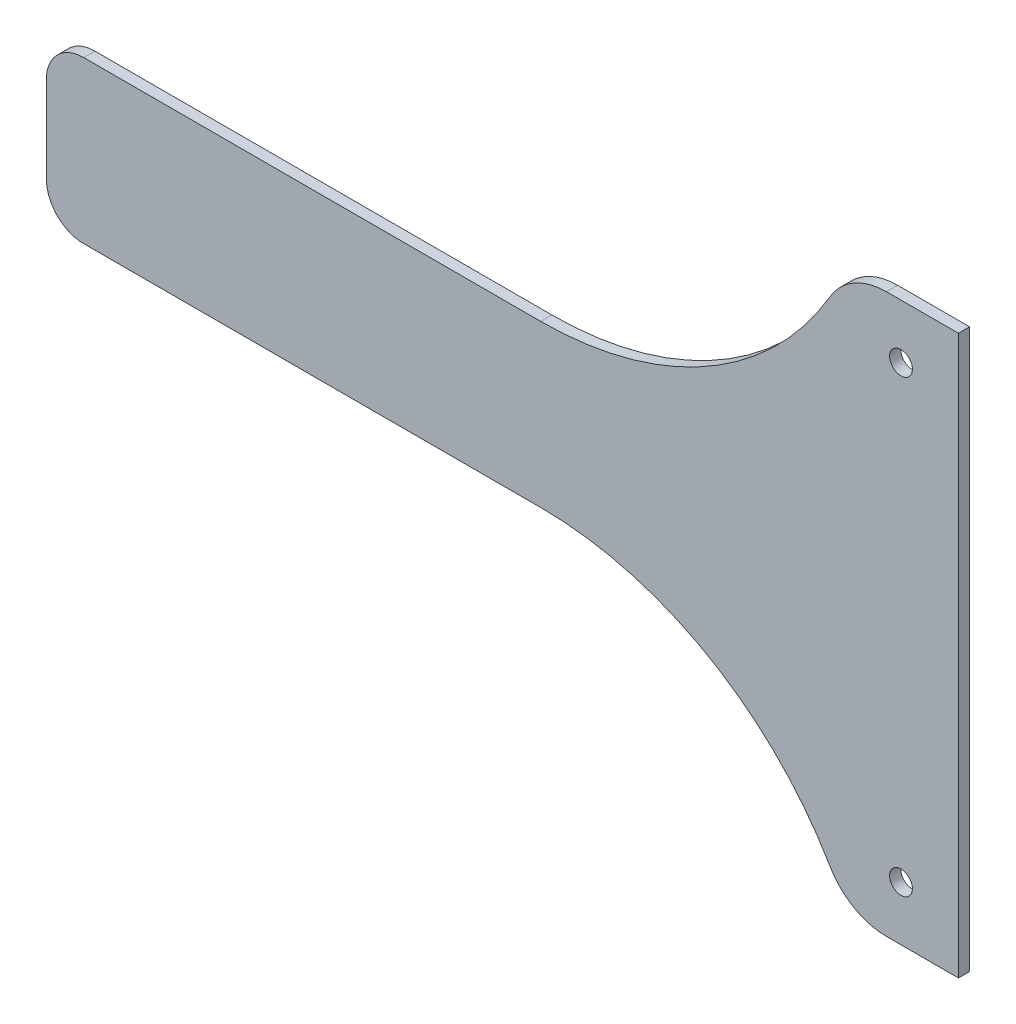
ISO-10303-21;
HEADER;
FILE_DESCRIPTION(('STEP AP214'),'2;1');
FILE_NAME('part.step','',(''),(''),'','','');
FILE_SCHEMA(('AUTOMOTIVE_DESIGN { 1 0 10303 214 1 1 1 1 }'));
ENDSEC;
DATA;
#1=APPLICATION_CONTEXT('core data for automotive mechanical design processes');
#2=APPLICATION_PROTOCOL_DEFINITION('international standard','automotive_design',2000,#1);
#3=PRODUCT_CONTEXT('',#1,'mechanical');
#4=PRODUCT('Part','Part','',(#3));
#5=PRODUCT_RELATED_PRODUCT_CATEGORY('part','',(#4));
#6=PRODUCT_DEFINITION_FORMATION('','',#4);
#7=PRODUCT_DEFINITION_CONTEXT('part definition',#1,'design');
#8=PRODUCT_DEFINITION('design','',#6,#7);
#9=PRODUCT_DEFINITION_SHAPE('','',#8);
#10=(LENGTH_UNIT() NAMED_UNIT(*) SI_UNIT(.MILLI.,.METRE.));
#11=(NAMED_UNIT(*) PLANE_ANGLE_UNIT() SI_UNIT($,.RADIAN.));
#12=(NAMED_UNIT(*) SI_UNIT($,.STERADIAN.) SOLID_ANGLE_UNIT());
#13=UNCERTAINTY_MEASURE_WITH_UNIT(LENGTH_MEASURE(1.E-05),#10,'distance_accuracy_value','');
#14=(GEOMETRIC_REPRESENTATION_CONTEXT(3) GLOBAL_UNCERTAINTY_ASSIGNED_CONTEXT((#13)) GLOBAL_UNIT_ASSIGNED_CONTEXT((#10,
#11,#12)) REPRESENTATION_CONTEXT('',''));
#15=CARTESIAN_POINT('',(0.,0.,0.));
#16=DIRECTION('',(0.,0.,1.));
#17=DIRECTION('',(1.,0.,0.));
#18=AXIS2_PLACEMENT_3D('',#15,#16,#17);
#19=CARTESIAN_POINT('',(0.,0.,1.524));
#20=DIRECTION('',(0.,0.,-1.));
#21=DIRECTION('',(-1.,0.,0.));
#22=AXIS2_PLACEMENT_3D('',#19,#20,#21);
#23=PLANE('',#22);
#24=CARTESIAN_POINT('',(-41.7574068730327,-18.6182,1.524));
#25=DIRECTION('',(0.,0.,-1.));
#26=DIRECTION('',(-1.,0.,0.));
#27=AXIS2_PLACEMENT_3D('',#24,#25,#26);
#28=CIRCLE('',#27,45.72);
#29=CARTESIAN_POINT('',(-41.7574068730327,27.1018,1.524));
#30=VERTEX_POINT('',#29);
#31=CARTESIAN_POINT('',(-2.26143328155298,4.41192093023256,1.524));
#32=VERTEX_POINT('',#31);
#33=EDGE_CURVE('E201',#30,#32,#28,.T.);
#34=ORIENTED_EDGE('',*,*,#33,.T.);
#35=CARTESIAN_POINT('',(5.41833936123474,8.88999999999999,1.524));
#36=DIRECTION('',(0.,0.,-1.));
#37=DIRECTION('',(-1.,0.,0.));
#38=AXIS2_PLACEMENT_3D('',#35,#36,#37);
#39=CIRCLE('',#38,8.89);
#40=CARTESIAN_POINT('',(5.41833936123474,0.,1.524));
#41=VERTEX_POINT('',#40);
#42=EDGE_CURVE('E130',#32,#41,#39,.F.);
#43=ORIENTED_EDGE('',*,*,#42,.T.);
#44=DIRECTION('',(1.,0.,0.));
#45=VECTOR('',#44,1.);
#46=CARTESIAN_POINT('',(0.,0.,1.524));
#47=LINE('',#46,#45);
#48=CARTESIAN_POINT('',(15.24,0.,1.524));
#49=VERTEX_POINT('',#48);
#50=EDGE_CURVE('E122',#41,#49,#47,.T.);
#51=ORIENTED_EDGE('',*,*,#50,.T.);
#52=DIRECTION('',(0.,1.,0.));
#53=VECTOR('',#52,1.);
#54=CARTESIAN_POINT('',(15.24,0.,1.524));
#55=LINE('',#54,#53);
#56=CARTESIAN_POINT('',(15.24,76.2,1.524));
#57=VERTEX_POINT('',#56);
#58=EDGE_CURVE('E127',#49,#57,#55,.T.);
#59=ORIENTED_EDGE('',*,*,#58,.T.);
#60=DIRECTION('',(-1.,0.,0.));
#61=VECTOR('',#60,1.);
#62=CARTESIAN_POINT('',(0.,76.2,1.524));
#63=LINE('',#62,#61);
#64=CARTESIAN_POINT('',(5.41833936123473,76.2,1.524));
#65=VERTEX_POINT('',#64);
#66=EDGE_CURVE('E148',#57,#65,#63,.T.);
#67=ORIENTED_EDGE('',*,*,#66,.T.);
#68=CARTESIAN_POINT('',(5.41833936123473,67.31,1.524));
#69=DIRECTION('',(0.,0.,-1.));
#70=DIRECTION('',(-1.,0.,0.));
#71=AXIS2_PLACEMENT_3D('',#68,#69,#70);
#72=CIRCLE('',#71,8.89);
#73=CARTESIAN_POINT('',(-2.26143328155298,71.7880790697674,1.524));
#74=VERTEX_POINT('',#73);
#75=EDGE_CURVE('E50',#65,#74,#72,.F.);
#76=ORIENTED_EDGE('',*,*,#75,.T.);
#77=CARTESIAN_POINT('',(-41.7574068730327,94.8182,1.524));
#78=DIRECTION('',(0.,0.,-1.));
#79=DIRECTION('',(-1.,0.,0.));
#80=AXIS2_PLACEMENT_3D('',#77,#78,#79);
#81=CIRCLE('',#80,45.72);
#82=CARTESIAN_POINT('',(-41.7574068730327,49.0982,1.524));
#83=VERTEX_POINT('',#82);
#84=EDGE_CURVE('E206',#74,#83,#81,.T.);
#85=ORIENTED_EDGE('',*,*,#84,.T.);
#86=DIRECTION('',(-1.,0.,0.));
#87=VECTOR('',#86,1.);
#88=CARTESIAN_POINT('',(-109.22,49.0982,1.524));
#89=LINE('',#88,#87);
#90=CARTESIAN_POINT('',(-104.14,49.0982,1.524));
#91=VERTEX_POINT('',#90);
#92=EDGE_CURVE('E150',#83,#91,#89,.T.);
#93=ORIENTED_EDGE('',*,*,#92,.T.);
#94=CARTESIAN_POINT('',(-104.14,44.0182,1.524));
#95=DIRECTION('',(0.,0.,-1.));
#96=DIRECTION('',(-1.,0.,0.));
#97=AXIS2_PLACEMENT_3D('',#94,#95,#96);
#98=CIRCLE('',#97,5.08);
#99=CARTESIAN_POINT('',(-109.22,44.0182,1.524));
#100=VERTEX_POINT('',#99);
#101=EDGE_CURVE('E187',#91,#100,#98,.F.);
#102=ORIENTED_EDGE('',*,*,#101,.T.);
#103=DIRECTION('',(0.,-1.,0.));
#104=VECTOR('',#103,1.);
#105=CARTESIAN_POINT('',(-109.22,27.1018,1.524));
#106=LINE('',#105,#104);
#107=CARTESIAN_POINT('',(-109.22,32.1818,1.524));
#108=VERTEX_POINT('',#107);
#109=EDGE_CURVE('E155',#100,#108,#106,.T.);
#110=ORIENTED_EDGE('',*,*,#109,.T.);
#111=CARTESIAN_POINT('',(-104.14,32.1818,1.524));
#112=DIRECTION('',(0.,0.,-1.));
#113=DIRECTION('',(-1.,0.,0.));
#114=AXIS2_PLACEMENT_3D('',#111,#112,#113);
#115=CIRCLE('',#114,5.08);
#116=CARTESIAN_POINT('',(-104.14,27.1018,1.524));
#117=VERTEX_POINT('',#116);
#118=EDGE_CURVE('E189',#108,#117,#115,.F.);
#119=ORIENTED_EDGE('',*,*,#118,.T.);
#120=DIRECTION('',(1.,0.,0.));
#121=VECTOR('',#120,1.);
#122=CARTESIAN_POINT('',(-109.22,27.1018,1.524));
#123=LINE('',#122,#121);
#124=EDGE_CURVE('E158',#117,#30,#123,.T.);
#125=ORIENTED_EDGE('',*,*,#124,.T.);
#126=EDGE_LOOP('',(#34,#43,#51,#59,#67,#76,#85,#93,#102,#110,#119,#125));
#127=FACE_BOUND('',#126,.T.);
#128=CARTESIAN_POINT('',(7.4041,68.7959,1.524));
#129=DIRECTION('',(0.,0.,1.));
#130=DIRECTION('',(1.,0.,0.));
#131=AXIS2_PLACEMENT_3D('',#128,#129,#130);
#132=CIRCLE('',#131,1.55575);
#133=CARTESIAN_POINT('',(5.84835,68.7959,1.524));
#134=VERTEX_POINT('',#133);
#135=EDGE_CURVE('E163',#134,#134,#132,.T.);
#136=ORIENTED_EDGE('',*,*,#135,.F.);
#137=EDGE_LOOP('',(#136));
#138=FACE_BOUND('',#137,.T.);
#139=CARTESIAN_POINT('',(7.40410000000001,7.40409999999997,1.524));
#140=DIRECTION('',(0.,0.,1.));
#141=DIRECTION('',(-1.,0.,0.));
#142=AXIS2_PLACEMENT_3D('',#139,#140,#141);
#143=CIRCLE('',#142,1.55575);
#144=CARTESIAN_POINT('',(5.84835000000001,7.40409999999997,1.524));
#145=VERTEX_POINT('',#144);
#146=EDGE_CURVE('E392',#145,#145,#143,.T.);
#147=ORIENTED_EDGE('',*,*,#146,.F.);
#148=EDGE_LOOP('',(#147));
#149=FACE_BOUND('',#148,.T.);
#150=ADVANCED_FACE('F35',(#127,#138,#149),#23,.F.);
#151=CARTESIAN_POINT('',(0.,0.,0.));
#152=DIRECTION('',(0.,0.,-1.));
#153=DIRECTION('',(-1.,0.,0.));
#154=AXIS2_PLACEMENT_3D('',#151,#152,#153);
#155=PLANE('',#154);
#156=CARTESIAN_POINT('',(7.4041,68.7959,0.));
#157=DIRECTION('',(0.,0.,1.));
#158=DIRECTION('',(1.,0.,0.));
#159=AXIS2_PLACEMENT_3D('',#156,#157,#158);
#160=CIRCLE('',#159,1.55575);
#161=CARTESIAN_POINT('',(5.84835,68.7959,0.));
#162=VERTEX_POINT('',#161);
#163=EDGE_CURVE('E397',#162,#162,#160,.T.);
#164=ORIENTED_EDGE('',*,*,#163,.T.);
#165=EDGE_LOOP('',(#164));
#166=FACE_BOUND('',#165,.T.);
#167=DIRECTION('',(1.,0.,0.));
#168=VECTOR('',#167,1.);
#169=CARTESIAN_POINT('',(0.,0.,0.));
#170=LINE('',#169,#168);
#171=CARTESIAN_POINT('',(5.41833936123474,0.,0.));
#172=VERTEX_POINT('',#171);
#173=CARTESIAN_POINT('',(15.24,0.,0.));
#174=VERTEX_POINT('',#173);
#175=EDGE_CURVE('E140',#172,#174,#170,.T.);
#176=ORIENTED_EDGE('',*,*,#175,.F.);
#177=CARTESIAN_POINT('',(5.41833936123474,8.88999999999999,0.));
#178=DIRECTION('',(0.,0.,-1.));
#179=DIRECTION('',(-1.,0.,0.));
#180=AXIS2_PLACEMENT_3D('',#177,#178,#179);
#181=CIRCLE('',#180,8.89);
#182=CARTESIAN_POINT('',(-2.26143328155298,4.41192093023256,0.));
#183=VERTEX_POINT('',#182);
#184=EDGE_CURVE('E212',#172,#183,#181,.T.);
#185=ORIENTED_EDGE('',*,*,#184,.T.);
#186=CARTESIAN_POINT('',(-41.7574068730327,-18.6182,0.));
#187=DIRECTION('',(0.,0.,-1.));
#188=DIRECTION('',(-1.,0.,0.));
#189=AXIS2_PLACEMENT_3D('',#186,#187,#188);
#190=CIRCLE('',#189,45.72);
#191=CARTESIAN_POINT('',(-41.7574068730327,27.1018,0.));
#192=VERTEX_POINT('',#191);
#193=EDGE_CURVE('E199',#183,#192,#190,.F.);
#194=ORIENTED_EDGE('',*,*,#193,.T.);
#195=DIRECTION('',(1.,0.,0.));
#196=VECTOR('',#195,1.);
#197=CARTESIAN_POINT('',(-109.22,27.1018,0.));
#198=LINE('',#197,#196);
#199=CARTESIAN_POINT('',(-104.14,27.1018,0.));
#200=VERTEX_POINT('',#199);
#201=EDGE_CURVE('E134',#200,#192,#198,.T.);
#202=ORIENTED_EDGE('',*,*,#201,.F.);
#203=CARTESIAN_POINT('',(-104.14,32.1818,0.));
#204=DIRECTION('',(0.,0.,-1.));
#205=DIRECTION('',(-1.,0.,0.));
#206=AXIS2_PLACEMENT_3D('',#203,#204,#205);
#207=CIRCLE('',#206,5.08);
#208=CARTESIAN_POINT('',(-109.22,32.1818,0.));
#209=VERTEX_POINT('',#208);
#210=EDGE_CURVE('E180',#200,#209,#207,.T.);
#211=ORIENTED_EDGE('',*,*,#210,.T.);
#212=DIRECTION('',(0.,-1.,0.));
#213=VECTOR('',#212,1.);
#214=CARTESIAN_POINT('',(-109.22,27.1018,0.));
#215=LINE('',#214,#213);
#216=CARTESIAN_POINT('',(-109.22,44.0182,0.));
#217=VERTEX_POINT('',#216);
#218=EDGE_CURVE('E169',#217,#209,#215,.T.);
#219=ORIENTED_EDGE('',*,*,#218,.F.);
#220=CARTESIAN_POINT('',(-104.14,44.0182,0.));
#221=DIRECTION('',(0.,0.,-1.));
#222=DIRECTION('',(-1.,0.,0.));
#223=AXIS2_PLACEMENT_3D('',#220,#221,#222);
#224=CIRCLE('',#223,5.08);
#225=CARTESIAN_POINT('',(-104.14,49.0982,0.));
#226=VERTEX_POINT('',#225);
#227=EDGE_CURVE('E177',#217,#226,#224,.T.);
#228=ORIENTED_EDGE('',*,*,#227,.T.);
#229=DIRECTION('',(-1.,0.,0.));
#230=VECTOR('',#229,1.);
#231=CARTESIAN_POINT('',(-109.22,49.0982,0.));
#232=LINE('',#231,#230);
#233=CARTESIAN_POINT('',(-41.7574068730327,49.0982,0.));
#234=VERTEX_POINT('',#233);
#235=EDGE_CURVE('E167',#234,#226,#232,.T.);
#236=ORIENTED_EDGE('',*,*,#235,.F.);
#237=CARTESIAN_POINT('',(-41.7574068730327,94.8182,0.));
#238=DIRECTION('',(0.,0.,-1.));
#239=DIRECTION('',(-1.,0.,0.));
#240=AXIS2_PLACEMENT_3D('',#237,#238,#239);
#241=CIRCLE('',#240,45.72);
#242=CARTESIAN_POINT('',(-2.26143328155298,71.7880790697674,0.));
#243=VERTEX_POINT('',#242);
#244=EDGE_CURVE('E203',#234,#243,#241,.F.);
#245=ORIENTED_EDGE('',*,*,#244,.T.);
#246=CARTESIAN_POINT('',(5.41833936123473,67.31,0.));
#247=DIRECTION('',(0.,0.,-1.));
#248=DIRECTION('',(-1.,0.,0.));
#249=AXIS2_PLACEMENT_3D('',#246,#247,#248);
#250=CIRCLE('',#249,8.89);
#251=CARTESIAN_POINT('',(5.41833936123473,76.2,0.));
#252=VERTEX_POINT('',#251);
#253=EDGE_CURVE('E210',#243,#252,#250,.T.);
#254=ORIENTED_EDGE('',*,*,#253,.T.);
#255=DIRECTION('',(-1.,0.,0.));
#256=VECTOR('',#255,1.);
#257=CARTESIAN_POINT('',(0.,76.2,0.));
#258=LINE('',#257,#256);
#259=CARTESIAN_POINT('',(15.24,76.2,0.));
#260=VERTEX_POINT('',#259);
#261=EDGE_CURVE('E165',#260,#252,#258,.T.);
#262=ORIENTED_EDGE('',*,*,#261,.F.);
#263=DIRECTION('',(0.,1.,0.));
#264=VECTOR('',#263,1.);
#265=CARTESIAN_POINT('',(15.24,0.,0.));
#266=LINE('',#265,#264);
#267=EDGE_CURVE('E162',#174,#260,#266,.T.);
#268=ORIENTED_EDGE('',*,*,#267,.F.);
#269=EDGE_LOOP('',(#176,#185,#194,#202,#211,#219,#228,#236,#245,#254,#262,#268));
#270=FACE_BOUND('',#269,.T.);
#271=CARTESIAN_POINT('',(7.40410000000001,7.40409999999997,0.));
#272=DIRECTION('',(0.,0.,1.));
#273=DIRECTION('',(-1.,0.,0.));
#274=AXIS2_PLACEMENT_3D('',#271,#272,#273);
#275=CIRCLE('',#274,1.55575);
#276=CARTESIAN_POINT('',(5.84835000000001,7.40409999999997,0.));
#277=VERTEX_POINT('',#276);
#278=EDGE_CURVE('E395',#277,#277,#275,.T.);
#279=ORIENTED_EDGE('',*,*,#278,.T.);
#280=EDGE_LOOP('',(#279));
#281=FACE_BOUND('',#280,.T.);
#282=ADVANCED_FACE('F225',(#166,#270,#281),#155,.T.);
#283=CARTESIAN_POINT('',(0.,0.,1.524));
#284=DIRECTION('',(0.,1.,0.));
#285=DIRECTION('',(0.,0.,1.));
#286=AXIS2_PLACEMENT_3D('',#283,#284,#285);
#287=PLANE('',#286);
#288=ORIENTED_EDGE('',*,*,#50,.F.);
#289=DIRECTION('',(0.,0.,1.));
#290=VECTOR('',#289,1.);
#291=CARTESIAN_POINT('',(5.41833936123474,0.,1.524));
#292=LINE('',#291,#290);
#293=EDGE_CURVE('E208',#41,#172,#292,.F.);
#294=ORIENTED_EDGE('',*,*,#293,.T.);
#295=ORIENTED_EDGE('',*,*,#175,.T.);
#296=DIRECTION('',(0.,0.,-1.));
#297=VECTOR('',#296,1.);
#298=CARTESIAN_POINT('',(15.24,0.,1.524));
#299=LINE('',#298,#297);
#300=EDGE_CURVE('E137',#49,#174,#299,.T.);
#301=ORIENTED_EDGE('',*,*,#300,.F.);
#302=EDGE_LOOP('',(#288,#294,#295,#301));
#303=FACE_BOUND('',#302,.T.);
#304=ADVANCED_FACE('F138',(#303),#287,.F.);
#305=CARTESIAN_POINT('',(15.24,0.,1.524));
#306=DIRECTION('',(-1.,0.,0.));
#307=DIRECTION('',(0.,-1.,0.));
#308=AXIS2_PLACEMENT_3D('',#305,#306,#307);
#309=PLANE('',#308);
#310=ORIENTED_EDGE('',*,*,#267,.T.);
#311=DIRECTION('',(0.,0.,-1.));
#312=VECTOR('',#311,1.);
#313=CARTESIAN_POINT('',(15.24,76.2,1.524));
#314=LINE('',#313,#312);
#315=EDGE_CURVE('E144',#57,#260,#314,.T.);
#316=ORIENTED_EDGE('',*,*,#315,.F.);
#317=ORIENTED_EDGE('',*,*,#58,.F.);
#318=ORIENTED_EDGE('',*,*,#300,.T.);
#319=EDGE_LOOP('',(#310,#316,#317,#318));
#320=FACE_BOUND('',#319,.T.);
#321=ADVANCED_FACE('F146',(#320),#309,.F.);
#322=CARTESIAN_POINT('',(0.,76.2,1.524));
#323=DIRECTION('',(0.,-1.,0.));
#324=DIRECTION('',(0.,0.,-1.));
#325=AXIS2_PLACEMENT_3D('',#322,#323,#324);
#326=PLANE('',#325);
#327=ORIENTED_EDGE('',*,*,#261,.T.);
#328=DIRECTION('',(0.,0.,-1.));
#329=VECTOR('',#328,1.);
#330=CARTESIAN_POINT('',(5.41833936123473,76.2,1.524));
#331=LINE('',#330,#329);
#332=EDGE_CURVE('E11',#252,#65,#331,.F.);
#333=ORIENTED_EDGE('',*,*,#332,.T.);
#334=ORIENTED_EDGE('',*,*,#66,.F.);
#335=ORIENTED_EDGE('',*,*,#315,.T.);
#336=EDGE_LOOP('',(#327,#333,#334,#335));
#337=FACE_BOUND('',#336,.T.);
#338=ADVANCED_FACE('F274',(#337),#326,.F.);
#339=CARTESIAN_POINT('',(-109.22,49.0982,1.524));
#340=DIRECTION('',(0.,-1.,0.));
#341=DIRECTION('',(1.,0.,0.));
#342=AXIS2_PLACEMENT_3D('',#339,#340,#341);
#343=PLANE('',#342);
#344=ORIENTED_EDGE('',*,*,#92,.F.);
#345=DIRECTION('',(0.,0.,-1.));
#346=VECTOR('',#345,1.);
#347=CARTESIAN_POINT('',(-41.7574068730327,49.0982,1.524));
#348=LINE('',#347,#346);
#349=EDGE_CURVE('E196',#83,#234,#348,.T.);
#350=ORIENTED_EDGE('',*,*,#349,.T.);
#351=ORIENTED_EDGE('',*,*,#235,.T.);
#352=DIRECTION('',(0.,0.,-1.));
#353=VECTOR('',#352,1.);
#354=CARTESIAN_POINT('',(-104.14,49.0982,1.524));
#355=LINE('',#354,#353);
#356=EDGE_CURVE('E191',#226,#91,#355,.F.);
#357=ORIENTED_EDGE('',*,*,#356,.T.);
#358=EDGE_LOOP('',(#344,#350,#351,#357));
#359=FACE_BOUND('',#358,.T.);
#360=ADVANCED_FACE('F232',(#359),#343,.F.);
#361=CARTESIAN_POINT('',(-109.22,27.1018,1.524));
#362=DIRECTION('',(1.,0.,0.));
#363=DIRECTION('',(0.,0.,-1.));
#364=AXIS2_PLACEMENT_3D('',#361,#362,#363);
#365=PLANE('',#364);
#366=ORIENTED_EDGE('',*,*,#218,.T.);
#367=DIRECTION('',(0.,0.,-1.));
#368=VECTOR('',#367,1.);
#369=CARTESIAN_POINT('',(-109.22,32.1818,1.524));
#370=LINE('',#369,#368);
#371=EDGE_CURVE('E185',#209,#108,#370,.F.);
#372=ORIENTED_EDGE('',*,*,#371,.T.);
#373=ORIENTED_EDGE('',*,*,#109,.F.);
#374=DIRECTION('',(0.,0.,-1.));
#375=VECTOR('',#374,1.);
#376=CARTESIAN_POINT('',(-109.22,44.0182,1.524));
#377=LINE('',#376,#375);
#378=EDGE_CURVE('E182',#100,#217,#377,.T.);
#379=ORIENTED_EDGE('',*,*,#378,.T.);
#380=EDGE_LOOP('',(#366,#372,#373,#379));
#381=FACE_BOUND('',#380,.T.);
#382=ADVANCED_FACE('F239',(#381),#365,.F.);
#383=CARTESIAN_POINT('',(-109.22,27.1018,1.524));
#384=DIRECTION('',(0.,1.,0.));
#385=DIRECTION('',(-1.,0.,0.));
#386=AXIS2_PLACEMENT_3D('',#383,#384,#385);
#387=PLANE('',#386);
#388=ORIENTED_EDGE('',*,*,#201,.T.);
#389=DIRECTION('',(0.,0.,1.));
#390=VECTOR('',#389,1.);
#391=CARTESIAN_POINT('',(-41.7574068730327,27.1018,1.524));
#392=LINE('',#391,#390);
#393=EDGE_CURVE('E194',#192,#30,#392,.T.);
#394=ORIENTED_EDGE('',*,*,#393,.T.);
#395=ORIENTED_EDGE('',*,*,#124,.F.);
#396=DIRECTION('',(0.,0.,-1.));
#397=VECTOR('',#396,1.);
#398=CARTESIAN_POINT('',(-104.14,27.1018,1.524));
#399=LINE('',#398,#397);
#400=EDGE_CURVE('E143',#117,#200,#399,.T.);
#401=ORIENTED_EDGE('',*,*,#400,.T.);
#402=EDGE_LOOP('',(#388,#394,#395,#401));
#403=FACE_BOUND('',#402,.T.);
#404=ADVANCED_FACE('F266',(#403),#387,.F.);
#405=CARTESIAN_POINT('',(7.4041,68.7959,1.524));
#406=DIRECTION('',(0.,0.,-1.));
#407=DIRECTION('',(-1.,0.,0.));
#408=AXIS2_PLACEMENT_3D('',#405,#406,#407);
#409=CYLINDRICAL_SURFACE('',#408,1.55575);
#410=CARTESIAN_POINT('',(5.84835,68.7959,1.524));
#411=CARTESIAN_POINT('',(5.84835,68.7959,1.508125));
#412=CARTESIAN_POINT('',(5.84835,68.7959,1.49225));
#413=CARTESIAN_POINT('',(5.84835,68.7959,1.4605));
#414=CARTESIAN_POINT('',(5.84835,68.7959,1.444625));
#415=CARTESIAN_POINT('',(5.84835,68.7959,1.412875));
#416=CARTESIAN_POINT('',(5.84835,68.7959,1.397));
#417=CARTESIAN_POINT('',(5.84835,68.7959,1.36525));
#418=CARTESIAN_POINT('',(5.84835,68.7959,1.349375));
#419=CARTESIAN_POINT('',(5.84835,68.7959,1.317625));
#420=CARTESIAN_POINT('',(5.84835,68.7959,1.30175));
#421=CARTESIAN_POINT('',(5.84835,68.7959,1.27));
#422=CARTESIAN_POINT('',(5.84835,68.7959,1.254125));
#423=CARTESIAN_POINT('',(5.84835,68.7959,1.222375));
#424=CARTESIAN_POINT('',(5.84835,68.7959,1.2065));
#425=CARTESIAN_POINT('',(5.84835,68.7959,1.17475));
#426=CARTESIAN_POINT('',(5.84835,68.7959,1.158875));
#427=CARTESIAN_POINT('',(5.84835,68.7959,1.127125));
#428=CARTESIAN_POINT('',(5.84835,68.7959,1.11125));
#429=CARTESIAN_POINT('',(5.84835,68.7959,1.0795));
#430=CARTESIAN_POINT('',(5.84835,68.7959,1.063625));
#431=CARTESIAN_POINT('',(5.84835,68.7959,1.031875));
#432=CARTESIAN_POINT('',(5.84835,68.7959,1.016));
#433=CARTESIAN_POINT('',(5.84835,68.7959,0.98425));
#434=CARTESIAN_POINT('',(5.84835,68.7959,0.968375));
#435=CARTESIAN_POINT('',(5.84835,68.7959,0.936625));
#436=CARTESIAN_POINT('',(5.84835,68.7959,0.92075));
#437=CARTESIAN_POINT('',(5.84835,68.7959,0.889));
#438=CARTESIAN_POINT('',(5.84835,68.7959,0.873125));
#439=CARTESIAN_POINT('',(5.84835,68.7959,0.841375));
#440=CARTESIAN_POINT('',(5.84835,68.7959,0.8255));
#441=CARTESIAN_POINT('',(5.84835,68.7959,0.79375));
#442=CARTESIAN_POINT('',(5.84835,68.7959,0.777875));
#443=CARTESIAN_POINT('',(5.84835,68.7959,0.746125));
#444=CARTESIAN_POINT('',(5.84835,68.7959,0.73025));
#445=CARTESIAN_POINT('',(5.84835,68.7959,0.6985));
#446=CARTESIAN_POINT('',(5.84835,68.7959,0.682625));
#447=CARTESIAN_POINT('',(5.84835,68.7959,0.650875));
#448=CARTESIAN_POINT('',(5.84835,68.7959,0.635));
#449=CARTESIAN_POINT('',(5.84835,68.7959,0.60325));
#450=CARTESIAN_POINT('',(5.84835,68.7959,0.587375));
#451=CARTESIAN_POINT('',(5.84835,68.7959,0.555625));
#452=CARTESIAN_POINT('',(5.84835,68.7959,0.53975));
#453=CARTESIAN_POINT('',(5.84835,68.7959,0.508));
#454=CARTESIAN_POINT('',(5.84835,68.7959,0.492125));
#455=CARTESIAN_POINT('',(5.84835,68.7959,0.460375));
#456=CARTESIAN_POINT('',(5.84835,68.7959,0.4445));
#457=CARTESIAN_POINT('',(5.84835,68.7959,0.41275));
#458=CARTESIAN_POINT('',(5.84835,68.7959,0.396875));
#459=CARTESIAN_POINT('',(5.84835,68.7959,0.365125));
#460=CARTESIAN_POINT('',(5.84835,68.7959,0.34925));
#461=CARTESIAN_POINT('',(5.84835,68.7959,0.3175));
#462=CARTESIAN_POINT('',(5.84835,68.7959,0.301625));
#463=CARTESIAN_POINT('',(5.84835,68.7959,0.269875));
#464=CARTESIAN_POINT('',(5.84835,68.7959,0.254));
#465=CARTESIAN_POINT('',(5.84835,68.7959,0.22225));
#466=CARTESIAN_POINT('',(5.84835,68.7959,0.206375));
#467=CARTESIAN_POINT('',(5.84835,68.7959,0.174625));
#468=CARTESIAN_POINT('',(5.84835,68.7959,0.15875));
#469=CARTESIAN_POINT('',(5.84835,68.7959,0.127));
#470=CARTESIAN_POINT('',(5.84835,68.7959,0.111125));
#471=CARTESIAN_POINT('',(5.84835,68.7959,0.079375));
#472=CARTESIAN_POINT('',(5.84835,68.7959,0.0635));
#473=CARTESIAN_POINT('',(5.84835,68.7959,0.0317499999999999));
#474=CARTESIAN_POINT('',(5.84835,68.7959,0.015875));
#475=CARTESIAN_POINT('',(5.84835,68.7959,0.));
#476=B_SPLINE_CURVE_WITH_KNOTS('',3,(#410,#411,#412,#413,#414,#415,#416,#417,#418,#419,#420,
#421,#422,#423,#424,#425,#426,#427,#428,#429,#430,#431,#432,#433,#434,#435,#436,#437,#438,#439,
#440,#441,#442,#443,#444,#445,#446,#447,#448,#449,#450,#451,#452,#453,#454,#455,#456,#457,#458,
#459,#460,#461,#462,#463,#464,#465,#466,#467,#468,#469,#470,#471,#472,#473,#474,#475),
.UNSPECIFIED.,.F.,.F.,(4,2,2,2,2,2,2,2,2,2,2,2,2,2,2,2,2,2,2,2,2,2,2,2,2,2,2,2,2,2,2,2,4),(0.,
0.0476249999999999,0.0952499999999998,0.142875,0.1905,0.238125,0.28575,0.333375,0.381,0.428625,
0.47625,0.523875,0.5715,0.619125,0.66675,0.714375,0.762,0.809625,0.85725,0.904875,0.9525,
1.000125,1.04775,1.095375,1.143,1.190625,1.23825,1.285875,1.3335,1.381125,1.42875,1.476375,
1.524),.UNSPECIFIED.);
#477=EDGE_CURVE('BSEAM263',#134,#162,#476,.T.);
#478=ORIENTED_EDGE('',*,*,#135,.T.);
#479=ORIENTED_EDGE('',*,*,#163,.F.);
#480=ORIENTED_EDGE('',*,*,#477,.T.);
#481=ORIENTED_EDGE('',*,*,#477,.F.);
#482=EDGE_LOOP('',(#478,#480,#479,#481));
#483=FACE_BOUND('',#482,.T.);
#484=ADVANCED_FACE('F263',(#483),#409,.F.);
#485=CARTESIAN_POINT('',(7.40410000000001,7.40409999999997,1.524));
#486=DIRECTION('',(0.,0.,-1.));
#487=DIRECTION('',(-1.,0.,0.));
#488=AXIS2_PLACEMENT_3D('',#485,#486,#487);
#489=CYLINDRICAL_SURFACE('',#488,1.55575);
#490=CARTESIAN_POINT('',(5.84835000000001,7.40409999999997,1.524));
#491=CARTESIAN_POINT('',(5.84835000000001,7.40409999999997,1.508125));
#492=CARTESIAN_POINT('',(5.84835000000001,7.40409999999997,1.49225));
#493=CARTESIAN_POINT('',(5.84835000000001,7.40409999999997,1.4605));
#494=CARTESIAN_POINT('',(5.84835000000001,7.40409999999997,1.444625));
#495=CARTESIAN_POINT('',(5.84835000000001,7.40409999999997,1.412875));
#496=CARTESIAN_POINT('',(5.84835000000001,7.40409999999997,1.397));
#497=CARTESIAN_POINT('',(5.84835000000001,7.40409999999997,1.36525));
#498=CARTESIAN_POINT('',(5.84835000000001,7.40409999999997,1.349375));
#499=CARTESIAN_POINT('',(5.84835000000001,7.40409999999997,1.317625));
#500=CARTESIAN_POINT('',(5.84835000000001,7.40409999999997,1.30175));
#501=CARTESIAN_POINT('',(5.84835000000001,7.40409999999997,1.27));
#502=CARTESIAN_POINT('',(5.84835000000001,7.40409999999997,1.254125));
#503=CARTESIAN_POINT('',(5.84835000000001,7.40409999999997,1.222375));
#504=CARTESIAN_POINT('',(5.84835000000001,7.40409999999997,1.2065));
#505=CARTESIAN_POINT('',(5.84835000000001,7.40409999999997,1.17475));
#506=CARTESIAN_POINT('',(5.84835000000001,7.40409999999997,1.158875));
#507=CARTESIAN_POINT('',(5.84835000000001,7.40409999999997,1.127125));
#508=CARTESIAN_POINT('',(5.84835000000001,7.40409999999997,1.11125));
#509=CARTESIAN_POINT('',(5.84835000000001,7.40409999999997,1.0795));
#510=CARTESIAN_POINT('',(5.84835000000001,7.40409999999997,1.063625));
#511=CARTESIAN_POINT('',(5.84835000000001,7.40409999999997,1.031875));
#512=CARTESIAN_POINT('',(5.84835000000001,7.40409999999997,1.016));
#513=CARTESIAN_POINT('',(5.84835000000001,7.40409999999997,0.98425));
#514=CARTESIAN_POINT('',(5.84835000000001,7.40409999999997,0.968375));
#515=CARTESIAN_POINT('',(5.84835000000001,7.40409999999997,0.936625));
#516=CARTESIAN_POINT('',(5.84835000000001,7.40409999999997,0.92075));
#517=CARTESIAN_POINT('',(5.84835000000001,7.40409999999997,0.889));
#518=CARTESIAN_POINT('',(5.84835000000001,7.40409999999997,0.873125));
#519=CARTESIAN_POINT('',(5.84835000000001,7.40409999999997,0.841375));
#520=CARTESIAN_POINT('',(5.84835000000001,7.40409999999997,0.8255));
#521=CARTESIAN_POINT('',(5.84835000000001,7.40409999999997,0.79375));
#522=CARTESIAN_POINT('',(5.84835000000001,7.40409999999997,0.777875));
#523=CARTESIAN_POINT('',(5.84835000000001,7.40409999999997,0.746125));
#524=CARTESIAN_POINT('',(5.84835000000001,7.40409999999997,0.73025));
#525=CARTESIAN_POINT('',(5.84835000000001,7.40409999999997,0.6985));
#526=CARTESIAN_POINT('',(5.84835000000001,7.40409999999997,0.682625));
#527=CARTESIAN_POINT('',(5.84835000000001,7.40409999999997,0.650875));
#528=CARTESIAN_POINT('',(5.84835000000001,7.40409999999997,0.635));
#529=CARTESIAN_POINT('',(5.84835000000001,7.40409999999997,0.60325));
#530=CARTESIAN_POINT('',(5.84835000000001,7.40409999999997,0.587375));
#531=CARTESIAN_POINT('',(5.84835000000001,7.40409999999997,0.555625));
#532=CARTESIAN_POINT('',(5.84835000000001,7.40409999999997,0.53975));
#533=CARTESIAN_POINT('',(5.84835000000001,7.40409999999997,0.508));
#534=CARTESIAN_POINT('',(5.84835000000001,7.40409999999997,0.492125));
#535=CARTESIAN_POINT('',(5.84835000000001,7.40409999999997,0.460375));
#536=CARTESIAN_POINT('',(5.84835000000001,7.40409999999997,0.4445));
#537=CARTESIAN_POINT('',(5.84835000000001,7.40409999999997,0.41275));
#538=CARTESIAN_POINT('',(5.84835000000001,7.40409999999997,0.396875));
#539=CARTESIAN_POINT('',(5.84835000000001,7.40409999999997,0.365125));
#540=CARTESIAN_POINT('',(5.84835000000001,7.40409999999997,0.34925));
#541=CARTESIAN_POINT('',(5.84835000000001,7.40409999999997,0.3175));
#542=CARTESIAN_POINT('',(5.84835000000001,7.40409999999997,0.301625));
#543=CARTESIAN_POINT('',(5.84835000000001,7.40409999999997,0.269875));
#544=CARTESIAN_POINT('',(5.84835000000001,7.40409999999997,0.254));
#545=CARTESIAN_POINT('',(5.84835000000001,7.40409999999997,0.22225));
#546=CARTESIAN_POINT('',(5.84835000000001,7.40409999999997,0.206375));
#547=CARTESIAN_POINT('',(5.84835000000001,7.40409999999997,0.174625));
#548=CARTESIAN_POINT('',(5.84835000000001,7.40409999999997,0.15875));
#549=CARTESIAN_POINT('',(5.84835000000001,7.40409999999997,0.127));
#550=CARTESIAN_POINT('',(5.84835000000001,7.40409999999997,0.111125));
#551=CARTESIAN_POINT('',(5.84835000000001,7.40409999999997,0.079375));
#552=CARTESIAN_POINT('',(5.84835000000001,7.40409999999997,0.0635));
#553=CARTESIAN_POINT('',(5.84835000000001,7.40409999999997,0.0317499999999999));
#554=CARTESIAN_POINT('',(5.84835000000001,7.40409999999997,0.015875));
#555=CARTESIAN_POINT('',(5.84835000000001,7.40409999999997,0.));
#556=B_SPLINE_CURVE_WITH_KNOTS('',3,(#490,#491,#492,#493,#494,#495,#496,#497,#498,#499,#500,
#501,#502,#503,#504,#505,#506,#507,#508,#509,#510,#511,#512,#513,#514,#515,#516,#517,#518,#519,
#520,#521,#522,#523,#524,#525,#526,#527,#528,#529,#530,#531,#532,#533,#534,#535,#536,#537,#538,
#539,#540,#541,#542,#543,#544,#545,#546,#547,#548,#549,#550,#551,#552,#553,#554,#555),
.UNSPECIFIED.,.F.,.F.,(4,2,2,2,2,2,2,2,2,2,2,2,2,2,2,2,2,2,2,2,2,2,2,2,2,2,2,2,2,2,2,2,4),(0.,
0.0476249999999999,0.0952499999999998,0.142875,0.1905,0.238125,0.28575,0.333375,0.381,0.428625,
0.47625,0.523875,0.5715,0.619125,0.66675,0.714375,0.762,0.809625,0.85725,0.904875,0.9525,
1.000125,1.04775,1.095375,1.143,1.190625,1.23825,1.285875,1.3335,1.381125,1.42875,1.476375,
1.524),.UNSPECIFIED.);
#557=EDGE_CURVE('BSEAM252',#145,#277,#556,.T.);
#558=ORIENTED_EDGE('',*,*,#146,.T.);
#559=ORIENTED_EDGE('',*,*,#278,.F.);
#560=ORIENTED_EDGE('',*,*,#557,.T.);
#561=ORIENTED_EDGE('',*,*,#557,.F.);
#562=EDGE_LOOP('',(#558,#560,#559,#561));
#563=FACE_BOUND('',#562,.T.);
#564=ADVANCED_FACE('F252',(#563),#489,.F.);
#565=CARTESIAN_POINT('',(-104.14,32.1818,1.524));
#566=DIRECTION('',(0.,0.,-1.));
#567=DIRECTION('',(-1.,0.,0.));
#568=AXIS2_PLACEMENT_3D('',#565,#566,#567);
#569=CYLINDRICAL_SURFACE('',#568,5.08);
#570=ORIENTED_EDGE('',*,*,#118,.F.);
#571=ORIENTED_EDGE('',*,*,#371,.F.);
#572=ORIENTED_EDGE('',*,*,#210,.F.);
#573=ORIENTED_EDGE('',*,*,#400,.F.);
#574=EDGE_LOOP('',(#570,#571,#572,#573));
#575=FACE_BOUND('',#574,.T.);
#576=ADVANCED_FACE('F244',(#575),#569,.T.);
#577=CARTESIAN_POINT('',(-104.14,44.0182,1.524));
#578=DIRECTION('',(0.,0.,-1.));
#579=DIRECTION('',(-1.,0.,0.));
#580=AXIS2_PLACEMENT_3D('',#577,#578,#579);
#581=CYLINDRICAL_SURFACE('',#580,5.08);
#582=ORIENTED_EDGE('',*,*,#101,.F.);
#583=ORIENTED_EDGE('',*,*,#356,.F.);
#584=ORIENTED_EDGE('',*,*,#227,.F.);
#585=ORIENTED_EDGE('',*,*,#378,.F.);
#586=EDGE_LOOP('',(#582,#583,#584,#585));
#587=FACE_BOUND('',#586,.T.);
#588=ADVANCED_FACE('F241',(#587),#581,.T.);
#589=CARTESIAN_POINT('',(-41.7574068730327,-18.6182,1.524));
#590=DIRECTION('',(0.,0.,1.));
#591=DIRECTION('',(1.,0.,0.));
#592=AXIS2_PLACEMENT_3D('',#589,#590,#591);
#593=CYLINDRICAL_SURFACE('',#592,45.72);
#594=ORIENTED_EDGE('',*,*,#193,.F.);
#595=DIRECTION('',(0.,0.,1.));
#596=VECTOR('',#595,1.);
#597=CARTESIAN_POINT('',(-2.26143328155298,4.41192093023256,1.524));
#598=LINE('',#597,#596);
#599=EDGE_CURVE('E214',#183,#32,#598,.T.);
#600=ORIENTED_EDGE('',*,*,#599,.T.);
#601=ORIENTED_EDGE('',*,*,#33,.F.);
#602=ORIENTED_EDGE('',*,*,#393,.F.);
#603=EDGE_LOOP('',(#594,#600,#601,#602));
#604=FACE_BOUND('',#603,.T.);
#605=ADVANCED_FACE('F243',(#604),#593,.F.);
#606=CARTESIAN_POINT('',(-41.7574068730327,94.8182,1.524));
#607=DIRECTION('',(0.,0.,-1.));
#608=DIRECTION('',(-1.,0.,0.));
#609=AXIS2_PLACEMENT_3D('',#606,#607,#608);
#610=CYLINDRICAL_SURFACE('',#609,45.72);
#611=ORIENTED_EDGE('',*,*,#84,.F.);
#612=DIRECTION('',(0.,0.,-1.));
#613=VECTOR('',#612,1.);
#614=CARTESIAN_POINT('',(-2.26143328155299,71.7880790697674,1.524));
#615=LINE('',#614,#613);
#616=EDGE_CURVE('E43',#74,#243,#615,.T.);
#617=ORIENTED_EDGE('',*,*,#616,.T.);
#618=ORIENTED_EDGE('',*,*,#244,.F.);
#619=ORIENTED_EDGE('',*,*,#349,.F.);
#620=EDGE_LOOP('',(#611,#617,#618,#619));
#621=FACE_BOUND('',#620,.T.);
#622=ADVANCED_FACE('F220',(#621),#610,.F.);
#623=CARTESIAN_POINT('',(5.41833936123474,8.88999999999999,1.524));
#624=DIRECTION('',(0.,0.,1.));
#625=DIRECTION('',(1.,0.,0.));
#626=AXIS2_PLACEMENT_3D('',#623,#624,#625);
#627=CYLINDRICAL_SURFACE('',#626,8.89);
#628=ORIENTED_EDGE('',*,*,#42,.F.);
#629=ORIENTED_EDGE('',*,*,#599,.F.);
#630=ORIENTED_EDGE('',*,*,#184,.F.);
#631=ORIENTED_EDGE('',*,*,#293,.F.);
#632=EDGE_LOOP('',(#628,#629,#630,#631));
#633=FACE_BOUND('',#632,.T.);
#634=ADVANCED_FACE('F339',(#633),#627,.T.);
#635=CARTESIAN_POINT('',(5.41833936123473,67.31,1.524));
#636=DIRECTION('',(0.,0.,-1.));
#637=DIRECTION('',(-1.,0.,0.));
#638=AXIS2_PLACEMENT_3D('',#635,#636,#637);
#639=CYLINDRICAL_SURFACE('',#638,8.89);
#640=ORIENTED_EDGE('',*,*,#75,.F.);
#641=ORIENTED_EDGE('',*,*,#332,.F.);
#642=ORIENTED_EDGE('',*,*,#253,.F.);
#643=ORIENTED_EDGE('',*,*,#616,.F.);
#644=EDGE_LOOP('',(#640,#641,#642,#643));
#645=FACE_BOUND('',#644,.T.);
#646=ADVANCED_FACE('F37',(#645),#639,.T.);
#647=CLOSED_SHELL('',(#150,#282,#304,#321,#338,#360,#382,#404,#484,#564,#576,#588,#605,#622,
#634,#646));
#648=MANIFOLD_SOLID_BREP('B2',#647);
#649=ADVANCED_BREP_SHAPE_REPRESENTATION('',(#18,#648),#14);
#650=SHAPE_DEFINITION_REPRESENTATION(#9,#649);
ENDSEC;
END-ISO-10303-21;
